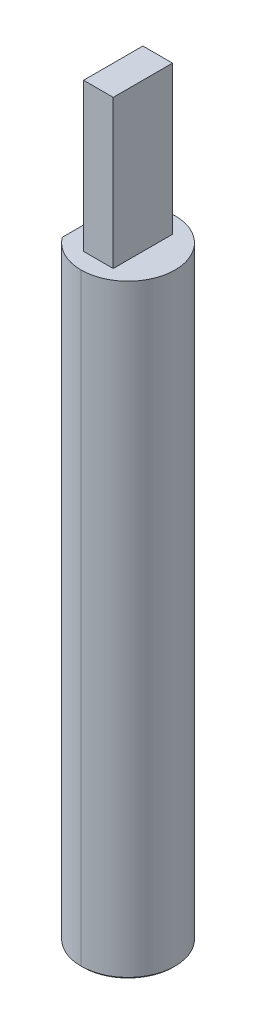
ISO-10303-21;
HEADER;
FILE_DESCRIPTION(('STEP AP214'),'2;1');
FILE_NAME('part.step','',(''),(''),'','','');
FILE_SCHEMA(('AUTOMOTIVE_DESIGN { 1 0 10303 214 1 1 1 1 }'));
ENDSEC;
DATA;
#1=APPLICATION_CONTEXT('core data for automotive mechanical design processes');
#2=APPLICATION_PROTOCOL_DEFINITION('international standard','automotive_design',2000,#1);
#3=PRODUCT_CONTEXT('',#1,'mechanical');
#4=PRODUCT('Part','Part','',(#3));
#5=PRODUCT_RELATED_PRODUCT_CATEGORY('part','',(#4));
#6=PRODUCT_DEFINITION_FORMATION('','',#4);
#7=PRODUCT_DEFINITION_CONTEXT('part definition',#1,'design');
#8=PRODUCT_DEFINITION('design','',#6,#7);
#9=PRODUCT_DEFINITION_SHAPE('','',#8);
#10=(LENGTH_UNIT() NAMED_UNIT(*) SI_UNIT(.MILLI.,.METRE.));
#11=(NAMED_UNIT(*) PLANE_ANGLE_UNIT() SI_UNIT($,.RADIAN.));
#12=(NAMED_UNIT(*) SI_UNIT($,.STERADIAN.) SOLID_ANGLE_UNIT());
#13=UNCERTAINTY_MEASURE_WITH_UNIT(LENGTH_MEASURE(1.E-05),#10,'distance_accuracy_value','');
#14=(GEOMETRIC_REPRESENTATION_CONTEXT(3) GLOBAL_UNCERTAINTY_ASSIGNED_CONTEXT((#13)) GLOBAL_UNIT_ASSIGNED_CONTEXT((#10,
#11,#12)) REPRESENTATION_CONTEXT('',''));
#15=CARTESIAN_POINT('',(0.,0.,0.));
#16=DIRECTION('',(0.,0.,1.));
#17=DIRECTION('',(1.,0.,0.));
#18=AXIS2_PLACEMENT_3D('',#15,#16,#17);
#19=CARTESIAN_POINT('',(-2.54381,50.8,-1.89353550270387));
#20=DIRECTION('',(1.,0.,0.));
#21=DIRECTION('',(0.,1.,0.));
#22=AXIS2_PLACEMENT_3D('',#19,#20,#21);
#23=PLANE('',#22);
#24=DIRECTION('',(0.,0.,1.));
#25=VECTOR('',#24,1.);
#26=CARTESIAN_POINT('',(-2.54381,40.8,-1.89353550270387));
#27=LINE('',#26,#25);
#28=CARTESIAN_POINT('',(-2.54381,40.8,-1.89353550270387));
#29=VERTEX_POINT('',#28);
#30=CARTESIAN_POINT('',(-2.54381,40.8,1.89353550270387));
#31=VERTEX_POINT('',#30);
#32=EDGE_CURVE('E167',#29,#31,#27,.T.);
#33=ORIENTED_EDGE('',*,*,#32,.F.);
#34=DIRECTION('',(0.,-1.,0.));
#35=VECTOR('',#34,1.);
#36=CARTESIAN_POINT('',(-2.54381,50.8,-1.89353550270387));
#37=LINE('',#36,#35);
#38=CARTESIAN_POINT('',(-2.54381,0.127000000000002,-1.89353550270387));
#39=VERTEX_POINT('',#38);
#40=EDGE_CURVE('E184',#29,#39,#37,.T.);
#41=ORIENTED_EDGE('',*,*,#40,.T.);
#42=CARTESIAN_POINT('',(-2.54381,0.127000000000002,-1.89353550270387));
#43=CARTESIAN_POINT('',(-2.54381,0.08338625355595,-1.8204935785422));
#44=CARTESIAN_POINT('',(-2.54381,0.0409575857320566,-1.74672509100731));
#45=CARTESIAN_POINT('',(-2.54381,0.,-1.67216130800829));
#46=(BOUNDED_CURVE() B_SPLINE_CURVE(3,(#42,#43,#44,#45),.UNSPECIFIED.,.F.,
.F.) B_SPLINE_CURVE_WITH_KNOTS((4,4),(0.,0.000255216641458037),
.UNSPECIFIED.) CURVE() GEOMETRIC_REPRESENTATION_ITEM() RATIONAL_B_SPLINE_CURVE((1.,1.,1.,1.)) REPRESENTATION_ITEM(''));
#47=CARTESIAN_POINT('',(-2.54381,0.,-1.67216130800829));
#48=VERTEX_POINT('',#47);
#49=EDGE_CURVE('E205',#39,#48,#46,.T.);
#50=ORIENTED_EDGE('',*,*,#49,.T.);
#51=DIRECTION('',(0.,0.,1.));
#52=VECTOR('',#51,1.);
#53=CARTESIAN_POINT('',(-2.54381,0.,-1.89353550270387));
#54=LINE('',#53,#52);
#55=CARTESIAN_POINT('',(-2.54381,0.,1.67216130800829));
#56=VERTEX_POINT('',#55);
#57=EDGE_CURVE('E201',#48,#56,#54,.T.);
#58=ORIENTED_EDGE('',*,*,#57,.T.);
#59=CARTESIAN_POINT('',(-2.54381,0.,1.67216130800829));
#60=CARTESIAN_POINT('',(-2.54381,0.0409575857320628,1.7467250910073));
#61=CARTESIAN_POINT('',(-2.54381,0.0833862535559464,1.82049357854221));
#62=CARTESIAN_POINT('',(-2.54381,0.127000000000002,1.89353550270387));
#63=(BOUNDED_CURVE() B_SPLINE_CURVE(3,(#59,#60,#61,#62),.UNSPECIFIED.,.F.,
.F.) B_SPLINE_CURVE_WITH_KNOTS((4,4),(0.,0.000255216641458037),
.UNSPECIFIED.) CURVE() GEOMETRIC_REPRESENTATION_ITEM() RATIONAL_B_SPLINE_CURVE((1.,1.,1.,1.)) REPRESENTATION_ITEM(''));
#64=CARTESIAN_POINT('',(-2.54381,0.127000000000002,1.89353550270387));
#65=VERTEX_POINT('',#64);
#66=EDGE_CURVE('E173',#56,#65,#63,.T.);
#67=ORIENTED_EDGE('',*,*,#66,.T.);
#68=DIRECTION('',(0.,-1.,0.));
#69=VECTOR('',#68,1.);
#70=CARTESIAN_POINT('',(-2.54381,50.8,1.89353550270387));
#71=LINE('',#70,#69);
#72=EDGE_CURVE('E190',#31,#65,#71,.T.);
#73=ORIENTED_EDGE('',*,*,#72,.F.);
#74=EDGE_LOOP('',(#33,#41,#50,#58,#67,#73));
#75=FACE_BOUND('',#74,.T.);
#76=ADVANCED_FACE('F39',(#75),#23,.F.);
#77=CARTESIAN_POINT('',(0.,50.8,0.));
#78=DIRECTION('',(0.,-1.,0.));
#79=DIRECTION('',(0.,0.,-1.));
#80=AXIS2_PLACEMENT_3D('',#77,#78,#79);
#81=CYLINDRICAL_SURFACE('',#80,3.17119);
#82=DIRECTION('',(0.,-1.,0.));
#83=VECTOR('',#82,1.);
#84=CARTESIAN_POINT('',(0.,50.8,3.17119));
#85=LINE('',#84,#83);
#86=CARTESIAN_POINT('',(0.,40.8,3.17119));
#87=VERTEX_POINT('',#86);
#88=CARTESIAN_POINT('',(0.,0.127000000000002,3.17119));
#89=VERTEX_POINT('',#88);
#90=EDGE_CURVE('E170',#87,#89,#85,.T.);
#91=ORIENTED_EDGE('',*,*,#90,.F.);
#92=CARTESIAN_POINT('',(0.,40.8,0.));
#93=DIRECTION('',(0.,1.,0.));
#94=DIRECTION('',(0.,0.,1.));
#95=AXIS2_PLACEMENT_3D('',#92,#93,#94);
#96=CIRCLE('',#95,3.17119);
#97=EDGE_CURVE('E62',#87,#31,#96,.F.);
#98=ORIENTED_EDGE('',*,*,#97,.T.);
#99=ORIENTED_EDGE('',*,*,#72,.T.);
#100=CARTESIAN_POINT('',(0.,0.127000000000002,0.));
#101=DIRECTION('',(0.,1.,0.));
#102=DIRECTION('',(0.,0.,1.));
#103=AXIS2_PLACEMENT_3D('',#100,#101,#102);
#104=CIRCLE('',#103,3.17119);
#105=EDGE_CURVE('E194',#65,#89,#104,.T.);
#106=ORIENTED_EDGE('',*,*,#105,.T.);
#107=EDGE_LOOP('',(#91,#98,#99,#106));
#108=FACE_BOUND('',#107,.T.);
#109=ADVANCED_FACE('F229',(#108),#81,.T.);
#110=CARTESIAN_POINT('',(0.,50.8,0.));
#111=DIRECTION('',(0.,-1.,0.));
#112=DIRECTION('',(0.,0.,-1.));
#113=AXIS2_PLACEMENT_3D('',#110,#111,#112);
#114=CYLINDRICAL_SURFACE('',#113,3.17119);
#115=ORIENTED_EDGE('',*,*,#40,.F.);
#116=CARTESIAN_POINT('',(0.,40.8,0.));
#117=DIRECTION('',(0.,1.,0.));
#118=DIRECTION('',(0.,0.,1.));
#119=AXIS2_PLACEMENT_3D('',#116,#117,#118);
#120=CIRCLE('',#119,3.17119);
#121=CARTESIAN_POINT('',(0.,40.8,-3.17119));
#122=VERTEX_POINT('',#121);
#123=EDGE_CURVE('E160',#29,#122,#120,.F.);
#124=ORIENTED_EDGE('',*,*,#123,.T.);
#125=DIRECTION('',(0.,-1.,0.));
#126=VECTOR('',#125,1.);
#127=CARTESIAN_POINT('',(0.,50.8,-3.17119));
#128=LINE('',#127,#126);
#129=CARTESIAN_POINT('',(0.,0.127000000000002,-3.17119));
#130=VERTEX_POINT('',#129);
#131=EDGE_CURVE('E172',#122,#130,#128,.T.);
#132=ORIENTED_EDGE('',*,*,#131,.T.);
#133=CARTESIAN_POINT('',(0.,0.127000000000002,0.));
#134=DIRECTION('',(0.,1.,0.));
#135=DIRECTION('',(0.,0.,1.));
#136=AXIS2_PLACEMENT_3D('',#133,#134,#135);
#137=CIRCLE('',#136,3.17119);
#138=EDGE_CURVE('E180',#130,#39,#137,.T.);
#139=ORIENTED_EDGE('',*,*,#138,.T.);
#140=EDGE_LOOP('',(#115,#124,#132,#139));
#141=FACE_BOUND('',#140,.T.);
#142=ADVANCED_FACE('F247',(#141),#114,.T.);
#143=CARTESIAN_POINT('',(0.,50.8,0.));
#144=DIRECTION('',(0.,-1.,0.));
#145=DIRECTION('',(0.,0.,-1.));
#146=AXIS2_PLACEMENT_3D('',#143,#144,#145);
#147=CYLINDRICAL_SURFACE('',#146,3.17119);
#148=ORIENTED_EDGE('',*,*,#131,.F.);
#149=CARTESIAN_POINT('',(0.,40.8,0.));
#150=DIRECTION('',(0.,1.,0.));
#151=DIRECTION('',(0.,0.,1.));
#152=AXIS2_PLACEMENT_3D('',#149,#150,#151);
#153=CIRCLE('',#152,3.17119);
#154=EDGE_CURVE('E12',#122,#87,#153,.F.);
#155=ORIENTED_EDGE('',*,*,#154,.T.);
#156=ORIENTED_EDGE('',*,*,#90,.T.);
#157=CARTESIAN_POINT('',(0.,0.127000000000002,0.));
#158=DIRECTION('',(0.,1.,0.));
#159=DIRECTION('',(0.,0.,1.));
#160=AXIS2_PLACEMENT_3D('',#157,#158,#159);
#161=CIRCLE('',#160,3.17119);
#162=EDGE_CURVE('E179',#89,#130,#161,.T.);
#163=ORIENTED_EDGE('',*,*,#162,.T.);
#164=EDGE_LOOP('',(#148,#155,#156,#163));
#165=FACE_BOUND('',#164,.T.);
#166=ADVANCED_FACE('F41',(#165),#147,.T.);
#167=CARTESIAN_POINT('',(0.,0.127000000000002,0.));
#168=DIRECTION('',(0.,1.,0.));
#169=DIRECTION('',(0.,0.,1.));
#170=AXIS2_PLACEMENT_3D('',#167,#168,#169);
#171=CONICAL_SURFACE('',#170,3.17119,0.785398163397457);
#172=DIRECTION('',(0.,0.707106781186542,-0.707106781186554));
#173=VECTOR('',#172,1.);
#174=CARTESIAN_POINT('',(0.,0.127000000000002,-3.17119));
#175=LINE('',#174,#173);
#176=CARTESIAN_POINT('',(0.,0.,-3.04419));
#177=VERTEX_POINT('',#176);
#178=EDGE_CURVE('E188',#177,#130,#175,.T.);
#179=ORIENTED_EDGE('',*,*,#178,.F.);
#180=CARTESIAN_POINT('',(0.,0.,0.));
#181=DIRECTION('',(0.,-1.,0.));
#182=DIRECTION('',(0.,0.,1.));
#183=AXIS2_PLACEMENT_3D('',#180,#181,#182);
#184=CIRCLE('',#183,3.04419);
#185=EDGE_CURVE('E47',#48,#177,#184,.T.);
#186=ORIENTED_EDGE('',*,*,#185,.F.);
#187=ORIENTED_EDGE('',*,*,#49,.F.);
#188=ORIENTED_EDGE('',*,*,#138,.F.);
#189=EDGE_LOOP('',(#179,#186,#187,#188));
#190=FACE_BOUND('',#189,.T.);
#191=ADVANCED_FACE('F251',(#190),#171,.T.);
#192=CARTESIAN_POINT('',(0.,0.,0.));
#193=DIRECTION('',(0.,1.,0.));
#194=DIRECTION('',(1.,0.,0.));
#195=AXIS2_PLACEMENT_3D('',#192,#193,#194);
#196=PLANE('',#195);
#197=ORIENTED_EDGE('',*,*,#57,.F.);
#198=ORIENTED_EDGE('',*,*,#185,.T.);
#199=CARTESIAN_POINT('',(0.,0.,0.));
#200=DIRECTION('',(0.,-1.,0.));
#201=DIRECTION('',(0.,0.,1.));
#202=AXIS2_PLACEMENT_3D('',#199,#200,#201);
#203=CIRCLE('',#202,3.04419);
#204=CARTESIAN_POINT('',(0.,0.,3.04419));
#205=VERTEX_POINT('',#204);
#206=EDGE_CURVE('E169',#177,#205,#203,.T.);
#207=ORIENTED_EDGE('',*,*,#206,.T.);
#208=CARTESIAN_POINT('',(0.,0.,0.));
#209=DIRECTION('',(0.,-1.,0.));
#210=DIRECTION('',(0.,0.,1.));
#211=AXIS2_PLACEMENT_3D('',#208,#209,#210);
#212=CIRCLE('',#211,3.04419);
#213=EDGE_CURVE('E178',#205,#56,#212,.T.);
#214=ORIENTED_EDGE('',*,*,#213,.T.);
#215=EDGE_LOOP('',(#197,#198,#207,#214));
#216=FACE_BOUND('',#215,.T.);
#217=ADVANCED_FACE('F253',(#216),#196,.F.);
#218=CARTESIAN_POINT('',(0.,0.127000000000002,0.));
#219=DIRECTION('',(0.,1.,0.));
#220=DIRECTION('',(0.,0.,1.));
#221=AXIS2_PLACEMENT_3D('',#218,#219,#220);
#222=CONICAL_SURFACE('',#221,3.17119,0.785398163397457);
#223=ORIENTED_EDGE('',*,*,#213,.F.);
#224=DIRECTION('',(0.,0.707106781186542,0.707106781186554));
#225=VECTOR('',#224,1.);
#226=CARTESIAN_POINT('',(0.,0.127000000000002,3.17119));
#227=LINE('',#226,#225);
#228=EDGE_CURVE('E174',#205,#89,#227,.T.);
#229=ORIENTED_EDGE('',*,*,#228,.T.);
#230=ORIENTED_EDGE('',*,*,#105,.F.);
#231=ORIENTED_EDGE('',*,*,#66,.F.);
#232=EDGE_LOOP('',(#223,#229,#230,#231));
#233=FACE_BOUND('',#232,.T.);
#234=ADVANCED_FACE('F236',(#233),#222,.T.);
#235=CARTESIAN_POINT('',(0.,0.127000000000002,0.));
#236=DIRECTION('',(0.,1.,0.));
#237=DIRECTION('',(0.,0.,1.));
#238=AXIS2_PLACEMENT_3D('',#235,#236,#237);
#239=CONICAL_SURFACE('',#238,3.17119,0.785398163397457);
#240=ORIENTED_EDGE('',*,*,#206,.F.);
#241=ORIENTED_EDGE('',*,*,#178,.T.);
#242=ORIENTED_EDGE('',*,*,#162,.F.);
#243=ORIENTED_EDGE('',*,*,#228,.F.);
#244=EDGE_LOOP('',(#240,#241,#242,#243));
#245=FACE_BOUND('',#244,.T.);
#246=ADVANCED_FACE('F241',(#245),#239,.T.);
#247=CARTESIAN_POINT('',(0.31369,40.8,0.));
#248=DIRECTION('',(0.,1.,0.));
#249=DIRECTION('',(0.,0.,1.));
#250=AXIS2_PLACEMENT_3D('',#247,#248,#249);
#251=PLANE('',#250);
#252=DIRECTION('',(-1.,0.,0.));
#253=VECTOR('',#252,1.);
#254=CARTESIAN_POINT('',(-0.999999999999999,40.8,-2.));
#255=LINE('',#254,#253);
#256=CARTESIAN_POINT('',(1.,40.8,-2.));
#257=VERTEX_POINT('',#256);
#258=CARTESIAN_POINT('',(-0.999999999999999,40.8,-2.));
#259=VERTEX_POINT('',#258);
#260=EDGE_CURVE('E135',#257,#259,#255,.T.);
#261=ORIENTED_EDGE('',*,*,#260,.F.);
#262=DIRECTION('',(0.,0.,-1.));
#263=VECTOR('',#262,1.);
#264=CARTESIAN_POINT('',(1.,40.8,-2.));
#265=LINE('',#264,#263);
#266=CARTESIAN_POINT('',(1.,40.8,2.));
#267=VERTEX_POINT('',#266);
#268=EDGE_CURVE('E144',#267,#257,#265,.T.);
#269=ORIENTED_EDGE('',*,*,#268,.F.);
#270=DIRECTION('',(1.,0.,0.));
#271=VECTOR('',#270,1.);
#272=CARTESIAN_POINT('',(-0.999999999999999,40.8,2.));
#273=LINE('',#272,#271);
#274=CARTESIAN_POINT('',(-0.999999999999999,40.8,2.));
#275=VERTEX_POINT('',#274);
#276=EDGE_CURVE('E127',#275,#267,#273,.T.);
#277=ORIENTED_EDGE('',*,*,#276,.F.);
#278=DIRECTION('',(0.,0.,1.));
#279=VECTOR('',#278,1.);
#280=CARTESIAN_POINT('',(-0.999999999999999,40.8,-2.));
#281=LINE('',#280,#279);
#282=EDGE_CURVE('E141',#259,#275,#281,.T.);
#283=ORIENTED_EDGE('',*,*,#282,.F.);
#284=EDGE_LOOP('',(#261,#269,#277,#283));
#285=FACE_BOUND('',#284,.T.);
#286=ORIENTED_EDGE('',*,*,#32,.T.);
#287=ORIENTED_EDGE('',*,*,#97,.F.);
#288=ORIENTED_EDGE('',*,*,#154,.F.);
#289=ORIENTED_EDGE('',*,*,#123,.F.);
#290=EDGE_LOOP('',(#286,#287,#288,#289));
#291=FACE_BOUND('',#290,.T.);
#292=ADVANCED_FACE('F140',(#285,#291),#251,.T.);
#293=CARTESIAN_POINT('',(-0.999999999999999,40.8,-2.));
#294=DIRECTION('',(-1.,0.,0.));
#295=DIRECTION('',(0.,0.,1.));
#296=AXIS2_PLACEMENT_3D('',#293,#294,#295);
#297=PLANE('',#296);
#298=DIRECTION('',(0.,0.,1.));
#299=VECTOR('',#298,1.);
#300=CARTESIAN_POINT('',(-0.999999999999999,50.8,-2.));
#301=LINE('',#300,#299);
#302=CARTESIAN_POINT('',(-0.999999999999999,50.8,-2.));
#303=VERTEX_POINT('',#302);
#304=CARTESIAN_POINT('',(-0.999999999999999,50.8,2.));
#305=VERTEX_POINT('',#304);
#306=EDGE_CURVE('E155',#303,#305,#301,.T.);
#307=ORIENTED_EDGE('',*,*,#306,.F.);
#308=DIRECTION('',(0.,1.,0.));
#309=VECTOR('',#308,1.);
#310=CARTESIAN_POINT('',(-0.999999999999999,40.8,-2.));
#311=LINE('',#310,#309);
#312=EDGE_CURVE('E147',#259,#303,#311,.T.);
#313=ORIENTED_EDGE('',*,*,#312,.F.);
#314=ORIENTED_EDGE('',*,*,#282,.T.);
#315=DIRECTION('',(0.,1.,0.));
#316=VECTOR('',#315,1.);
#317=CARTESIAN_POINT('',(-0.999999999999999,40.8,2.));
#318=LINE('',#317,#316);
#319=EDGE_CURVE('E124',#275,#305,#318,.T.);
#320=ORIENTED_EDGE('',*,*,#319,.T.);
#321=EDGE_LOOP('',(#307,#313,#314,#320));
#322=FACE_BOUND('',#321,.T.);
#323=ADVANCED_FACE('F146',(#322),#297,.T.);
#324=CARTESIAN_POINT('',(-0.999999999999999,40.8,-2.));
#325=DIRECTION('',(0.,0.,-1.));
#326=DIRECTION('',(-1.,0.,0.));
#327=AXIS2_PLACEMENT_3D('',#324,#325,#326);
#328=PLANE('',#327);
#329=DIRECTION('',(-1.,0.,0.));
#330=VECTOR('',#329,1.);
#331=CARTESIAN_POINT('',(-0.999999999999999,50.8,-2.));
#332=LINE('',#331,#330);
#333=CARTESIAN_POINT('',(1.,50.8,-2.));
#334=VERTEX_POINT('',#333);
#335=EDGE_CURVE('E148',#334,#303,#332,.T.);
#336=ORIENTED_EDGE('',*,*,#335,.F.);
#337=DIRECTION('',(0.,1.,0.));
#338=VECTOR('',#337,1.);
#339=CARTESIAN_POINT('',(1.,40.8,-2.));
#340=LINE('',#339,#338);
#341=EDGE_CURVE('E161',#257,#334,#340,.T.);
#342=ORIENTED_EDGE('',*,*,#341,.F.);
#343=ORIENTED_EDGE('',*,*,#260,.T.);
#344=ORIENTED_EDGE('',*,*,#312,.T.);
#345=EDGE_LOOP('',(#336,#342,#343,#344));
#346=FACE_BOUND('',#345,.T.);
#347=ADVANCED_FACE('F282',(#346),#328,.T.);
#348=CARTESIAN_POINT('',(1.,40.8,-2.));
#349=DIRECTION('',(1.,0.,0.));
#350=DIRECTION('',(0.,0.,-1.));
#351=AXIS2_PLACEMENT_3D('',#348,#349,#350);
#352=PLANE('',#351);
#353=DIRECTION('',(0.,0.,-1.));
#354=VECTOR('',#353,1.);
#355=CARTESIAN_POINT('',(1.,50.8,-2.));
#356=LINE('',#355,#354);
#357=CARTESIAN_POINT('',(1.,50.8,2.));
#358=VERTEX_POINT('',#357);
#359=EDGE_CURVE('E54',#358,#334,#356,.T.);
#360=ORIENTED_EDGE('',*,*,#359,.F.);
#361=DIRECTION('',(0.,1.,0.));
#362=VECTOR('',#361,1.);
#363=CARTESIAN_POINT('',(1.,40.8,2.));
#364=LINE('',#363,#362);
#365=EDGE_CURVE('E134',#267,#358,#364,.T.);
#366=ORIENTED_EDGE('',*,*,#365,.F.);
#367=ORIENTED_EDGE('',*,*,#268,.T.);
#368=ORIENTED_EDGE('',*,*,#341,.T.);
#369=EDGE_LOOP('',(#360,#366,#367,#368));
#370=FACE_BOUND('',#369,.T.);
#371=ADVANCED_FACE('F285',(#370),#352,.T.);
#372=CARTESIAN_POINT('',(-0.999999999999999,40.8,2.));
#373=DIRECTION('',(0.,0.,1.));
#374=DIRECTION('',(1.,0.,0.));
#375=AXIS2_PLACEMENT_3D('',#372,#373,#374);
#376=PLANE('',#375);
#377=DIRECTION('',(1.,0.,0.));
#378=VECTOR('',#377,1.);
#379=CARTESIAN_POINT('',(-0.999999999999999,50.8,2.));
#380=LINE('',#379,#378);
#381=EDGE_CURVE('E129',#305,#358,#380,.T.);
#382=ORIENTED_EDGE('',*,*,#381,.F.);
#383=ORIENTED_EDGE('',*,*,#319,.F.);
#384=ORIENTED_EDGE('',*,*,#276,.T.);
#385=ORIENTED_EDGE('',*,*,#365,.T.);
#386=EDGE_LOOP('',(#382,#383,#384,#385));
#387=FACE_BOUND('',#386,.T.);
#388=ADVANCED_FACE('F126',(#387),#376,.T.);
#389=CARTESIAN_POINT('',(0.,50.8,0.));
#390=DIRECTION('',(0.,1.,0.));
#391=DIRECTION('',(1.,0.,0.));
#392=AXIS2_PLACEMENT_3D('',#389,#390,#391);
#393=PLANE('',#392);
#394=ORIENTED_EDGE('',*,*,#335,.T.);
#395=ORIENTED_EDGE('',*,*,#306,.T.);
#396=ORIENTED_EDGE('',*,*,#381,.T.);
#397=ORIENTED_EDGE('',*,*,#359,.T.);
#398=EDGE_LOOP('',(#394,#395,#396,#397));
#399=FACE_BOUND('',#398,.T.);
#400=ADVANCED_FACE('F274',(#399),#393,.T.);
#401=CLOSED_SHELL('',(#76,#109,#142,#166,#191,#217,#234,#246,#292,#323,#347,#371,#388,#400));
#402=MANIFOLD_SOLID_BREP('B2',#401);
#403=ADVANCED_BREP_SHAPE_REPRESENTATION('',(#18,#402),#14);
#404=SHAPE_DEFINITION_REPRESENTATION(#9,#403);
ENDSEC;
END-ISO-10303-21;
